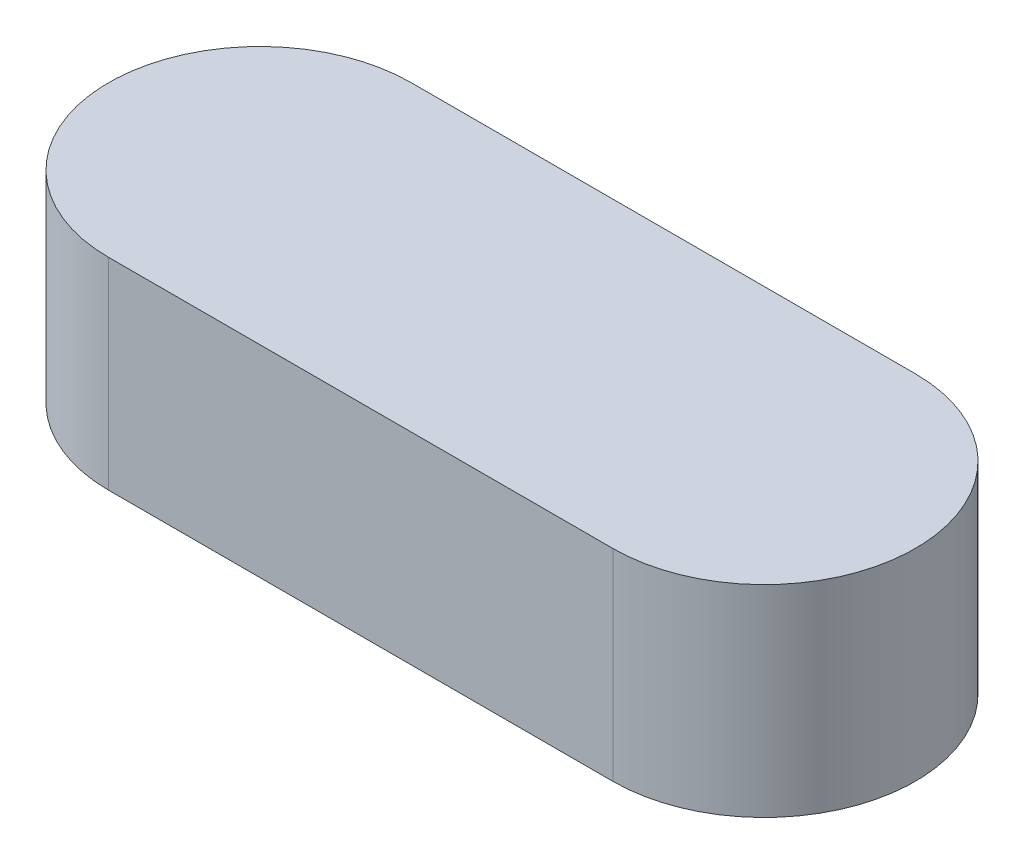
ISO-10303-21;
HEADER;
FILE_DESCRIPTION(('STEP AP214'),'2;1');
FILE_NAME('part.step','',(''),(''),'','','');
FILE_SCHEMA(('AUTOMOTIVE_DESIGN { 1 0 10303 214 1 1 1 1 }'));
ENDSEC;
DATA;
#1=APPLICATION_CONTEXT('core data for automotive mechanical design processes');
#2=APPLICATION_PROTOCOL_DEFINITION('international standard','automotive_design',2000,#1);
#3=PRODUCT_CONTEXT('',#1,'mechanical');
#4=PRODUCT('Part','Part','',(#3));
#5=PRODUCT_RELATED_PRODUCT_CATEGORY('part','',(#4));
#6=PRODUCT_DEFINITION_FORMATION('','',#4);
#7=PRODUCT_DEFINITION_CONTEXT('part definition',#1,'design');
#8=PRODUCT_DEFINITION('design','',#6,#7);
#9=PRODUCT_DEFINITION_SHAPE('','',#8);
#10=(LENGTH_UNIT() NAMED_UNIT(*) SI_UNIT(.MILLI.,.METRE.));
#11=(NAMED_UNIT(*) PLANE_ANGLE_UNIT() SI_UNIT($,.RADIAN.));
#12=(NAMED_UNIT(*) SI_UNIT($,.STERADIAN.) SOLID_ANGLE_UNIT());
#13=UNCERTAINTY_MEASURE_WITH_UNIT(LENGTH_MEASURE(1.E-05),#10,'distance_accuracy_value','');
#14=(GEOMETRIC_REPRESENTATION_CONTEXT(3) GLOBAL_UNCERTAINTY_ASSIGNED_CONTEXT((#13)) GLOBAL_UNIT_ASSIGNED_CONTEXT((#10,
#11,#12)) REPRESENTATION_CONTEXT('',''));
#15=CARTESIAN_POINT('',(0.,0.,0.));
#16=DIRECTION('',(0.,0.,1.));
#17=DIRECTION('',(1.,0.,0.));
#18=AXIS2_PLACEMENT_3D('',#15,#16,#17);
#19=CARTESIAN_POINT('',(-4.00000000000001,8.,-1.82857142857142));
#20=DIRECTION('',(0.,-1.,0.));
#21=DIRECTION('',(0.,0.,-1.));
#22=AXIS2_PLACEMENT_3D('',#19,#20,#21);
#23=CYLINDRICAL_SURFACE('',#22,6.);
#24=CARTESIAN_POINT('',(-4.00000000000001,0.,-1.82857142857142));
#25=DIRECTION('',(0.,1.,0.));
#26=DIRECTION('',(0.,0.,-1.));
#27=AXIS2_PLACEMENT_3D('',#24,#25,#26);
#28=CIRCLE('',#27,6.);
#29=CARTESIAN_POINT('',(-4.00000000000001,0.,-7.82857142857143));
#30=VERTEX_POINT('',#29);
#31=CARTESIAN_POINT('',(-4.00000000000001,0.,4.17142857142857));
#32=VERTEX_POINT('',#31);
#33=EDGE_CURVE('E96',#30,#32,#28,.T.);
#34=ORIENTED_EDGE('',*,*,#33,.T.);
#35=DIRECTION('',(0.,-1.,0.));
#36=VECTOR('',#35,1.);
#37=CARTESIAN_POINT('',(-4.00000000000001,8.,4.17142857142857));
#38=LINE('',#37,#36);
#39=CARTESIAN_POINT('',(-4.00000000000001,8.,4.17142857142857));
#40=VERTEX_POINT('',#39);
#41=EDGE_CURVE('E11',#40,#32,#38,.T.);
#42=ORIENTED_EDGE('',*,*,#41,.F.);
#43=CARTESIAN_POINT('',(-4.00000000000001,8.,-1.82857142857142));
#44=DIRECTION('',(0.,1.,0.));
#45=DIRECTION('',(0.,0.,-1.));
#46=AXIS2_PLACEMENT_3D('',#43,#44,#45);
#47=CIRCLE('',#46,6.);
#48=CARTESIAN_POINT('',(-4.00000000000001,8.,-7.82857142857143));
#49=VERTEX_POINT('',#48);
#50=EDGE_CURVE('E84',#49,#40,#47,.T.);
#51=ORIENTED_EDGE('',*,*,#50,.F.);
#52=DIRECTION('',(0.,-1.,0.));
#53=VECTOR('',#52,1.);
#54=CARTESIAN_POINT('',(-4.00000000000001,8.,-7.82857142857143));
#55=LINE('',#54,#53);
#56=EDGE_CURVE('E92',#49,#30,#55,.T.);
#57=ORIENTED_EDGE('',*,*,#56,.T.);
#58=EDGE_LOOP('',(#34,#42,#51,#57));
#59=FACE_BOUND('',#58,.T.);
#60=ADVANCED_FACE('F33',(#59),#23,.T.);
#61=CARTESIAN_POINT('',(16.,8.,4.17142857142857));
#62=DIRECTION('',(0.,0.,-1.));
#63=DIRECTION('',(-1.,0.,0.));
#64=AXIS2_PLACEMENT_3D('',#61,#62,#63);
#65=PLANE('',#64);
#66=DIRECTION('',(1.,0.,0.));
#67=VECTOR('',#66,1.);
#68=CARTESIAN_POINT('',(16.,0.,4.17142857142857));
#69=LINE('',#68,#67);
#70=CARTESIAN_POINT('',(16.,0.,4.17142857142857));
#71=VERTEX_POINT('',#70);
#72=EDGE_CURVE('E88',#32,#71,#69,.T.);
#73=ORIENTED_EDGE('',*,*,#72,.T.);
#74=DIRECTION('',(0.,-1.,0.));
#75=VECTOR('',#74,1.);
#76=CARTESIAN_POINT('',(16.,8.,4.17142857142857));
#77=LINE('',#76,#75);
#78=CARTESIAN_POINT('',(16.,8.,4.17142857142857));
#79=VERTEX_POINT('',#78);
#80=EDGE_CURVE('E41',#79,#71,#77,.T.);
#81=ORIENTED_EDGE('',*,*,#80,.F.);
#82=DIRECTION('',(1.,0.,0.));
#83=VECTOR('',#82,1.);
#84=CARTESIAN_POINT('',(16.,8.,4.17142857142857));
#85=LINE('',#84,#83);
#86=EDGE_CURVE('E79',#40,#79,#85,.T.);
#87=ORIENTED_EDGE('',*,*,#86,.F.);
#88=ORIENTED_EDGE('',*,*,#41,.T.);
#89=EDGE_LOOP('',(#73,#81,#87,#88));
#90=FACE_BOUND('',#89,.T.);
#91=ADVANCED_FACE('F87',(#90),#65,.F.);
#92=CARTESIAN_POINT('',(16.,8.,-1.82857142857143));
#93=DIRECTION('',(0.,-1.,0.));
#94=DIRECTION('',(0.,0.,-1.));
#95=AXIS2_PLACEMENT_3D('',#92,#93,#94);
#96=CYLINDRICAL_SURFACE('',#95,6.);
#97=CARTESIAN_POINT('',(16.,0.,-1.82857142857143));
#98=DIRECTION('',(0.,1.,0.));
#99=DIRECTION('',(0.,0.,-1.));
#100=AXIS2_PLACEMENT_3D('',#97,#98,#99);
#101=CIRCLE('',#100,6.);
#102=CARTESIAN_POINT('',(16.,0.,-7.82857142857143));
#103=VERTEX_POINT('',#102);
#104=EDGE_CURVE('E66',#71,#103,#101,.T.);
#105=ORIENTED_EDGE('',*,*,#104,.T.);
#106=DIRECTION('',(0.,-1.,0.));
#107=VECTOR('',#106,1.);
#108=CARTESIAN_POINT('',(16.,8.,-7.82857142857143));
#109=LINE('',#108,#107);
#110=CARTESIAN_POINT('',(16.,8.,-7.82857142857143));
#111=VERTEX_POINT('',#110);
#112=EDGE_CURVE('E89',#111,#103,#109,.T.);
#113=ORIENTED_EDGE('',*,*,#112,.F.);
#114=CARTESIAN_POINT('',(16.,8.,-1.82857142857143));
#115=DIRECTION('',(0.,1.,0.));
#116=DIRECTION('',(0.,0.,-1.));
#117=AXIS2_PLACEMENT_3D('',#114,#115,#116);
#118=CIRCLE('',#117,6.);
#119=EDGE_CURVE('E82',#79,#111,#118,.T.);
#120=ORIENTED_EDGE('',*,*,#119,.F.);
#121=ORIENTED_EDGE('',*,*,#80,.T.);
#122=EDGE_LOOP('',(#105,#113,#120,#121));
#123=FACE_BOUND('',#122,.T.);
#124=ADVANCED_FACE('F90',(#123),#96,.T.);
#125=CARTESIAN_POINT('',(-4.00000000000001,8.,-7.82857142857143));
#126=DIRECTION('',(0.,0.,1.));
#127=DIRECTION('',(1.,0.,0.));
#128=AXIS2_PLACEMENT_3D('',#125,#126,#127);
#129=PLANE('',#128);
#130=DIRECTION('',(-1.,0.,0.));
#131=VECTOR('',#130,1.);
#132=CARTESIAN_POINT('',(-4.00000000000001,0.,-7.82857142857143));
#133=LINE('',#132,#131);
#134=EDGE_CURVE('E72',#103,#30,#133,.T.);
#135=ORIENTED_EDGE('',*,*,#134,.T.);
#136=ORIENTED_EDGE('',*,*,#56,.F.);
#137=DIRECTION('',(-1.,0.,0.));
#138=VECTOR('',#137,1.);
#139=CARTESIAN_POINT('',(-4.00000000000001,8.,-7.82857142857143));
#140=LINE('',#139,#138);
#141=EDGE_CURVE('E49',#111,#49,#140,.T.);
#142=ORIENTED_EDGE('',*,*,#141,.F.);
#143=ORIENTED_EDGE('',*,*,#112,.T.);
#144=EDGE_LOOP('',(#135,#136,#142,#143));
#145=FACE_BOUND('',#144,.T.);
#146=ADVANCED_FACE('F103',(#145),#129,.F.);
#147=CARTESIAN_POINT('',(-4.00000000000001,8.,-1.82857142857142));
#148=DIRECTION('',(0.,-1.,0.));
#149=DIRECTION('',(0.,0.,-1.));
#150=AXIS2_PLACEMENT_3D('',#147,#148,#149);
#151=PLANE('',#150);
#152=ORIENTED_EDGE('',*,*,#50,.T.);
#153=ORIENTED_EDGE('',*,*,#86,.T.);
#154=ORIENTED_EDGE('',*,*,#119,.T.);
#155=ORIENTED_EDGE('',*,*,#141,.T.);
#156=EDGE_LOOP('',(#152,#153,#154,#155));
#157=FACE_BOUND('',#156,.T.);
#158=ADVANCED_FACE('F80',(#157),#151,.F.);
#159=CARTESIAN_POINT('',(-4.00000000000001,0.,-1.82857142857142));
#160=DIRECTION('',(0.,-1.,0.));
#161=DIRECTION('',(0.,0.,-1.));
#162=AXIS2_PLACEMENT_3D('',#159,#160,#161);
#163=PLANE('',#162);
#164=ORIENTED_EDGE('',*,*,#33,.F.);
#165=ORIENTED_EDGE('',*,*,#134,.F.);
#166=ORIENTED_EDGE('',*,*,#104,.F.);
#167=ORIENTED_EDGE('',*,*,#72,.F.);
#168=EDGE_LOOP('',(#164,#165,#166,#167));
#169=FACE_BOUND('',#168,.T.);
#170=ADVANCED_FACE('F106',(#169),#163,.T.);
#171=CLOSED_SHELL('',(#60,#91,#124,#146,#158,#170));
#172=MANIFOLD_SOLID_BREP('B2',#171);
#173=ADVANCED_BREP_SHAPE_REPRESENTATION('',(#18,#172),#14);
#174=SHAPE_DEFINITION_REPRESENTATION(#9,#173);
ENDSEC;
END-ISO-10303-21;
